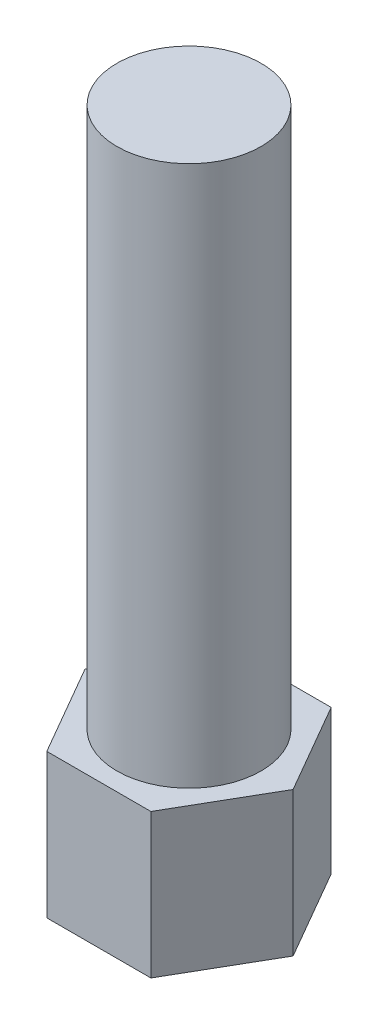
ISO-10303-21;
HEADER;
FILE_DESCRIPTION(('STEP AP214'),'2;1');
FILE_NAME('part.step','',(''),(''),'','','');
FILE_SCHEMA(('AUTOMOTIVE_DESIGN { 1 0 10303 214 1 1 1 1 }'));
ENDSEC;
DATA;
#1=APPLICATION_CONTEXT('core data for automotive mechanical design processes');
#2=APPLICATION_PROTOCOL_DEFINITION('international standard','automotive_design',2000,#1);
#3=PRODUCT_CONTEXT('',#1,'mechanical');
#4=PRODUCT('Part','Part','',(#3));
#5=PRODUCT_RELATED_PRODUCT_CATEGORY('part','',(#4));
#6=PRODUCT_DEFINITION_FORMATION('','',#4);
#7=PRODUCT_DEFINITION_CONTEXT('part definition',#1,'design');
#8=PRODUCT_DEFINITION('design','',#6,#7);
#9=PRODUCT_DEFINITION_SHAPE('','',#8);
#10=(LENGTH_UNIT() NAMED_UNIT(*) SI_UNIT(.MILLI.,.METRE.));
#11=(NAMED_UNIT(*) PLANE_ANGLE_UNIT() SI_UNIT($,.RADIAN.));
#12=(NAMED_UNIT(*) SI_UNIT($,.STERADIAN.) SOLID_ANGLE_UNIT());
#13=UNCERTAINTY_MEASURE_WITH_UNIT(LENGTH_MEASURE(1.E-05),#10,'distance_accuracy_value','');
#14=(GEOMETRIC_REPRESENTATION_CONTEXT(3) GLOBAL_UNCERTAINTY_ASSIGNED_CONTEXT((#13)) GLOBAL_UNIT_ASSIGNED_CONTEXT((#10,
#11,#12)) REPRESENTATION_CONTEXT('',''));
#15=CARTESIAN_POINT('',(0.,0.,0.));
#16=DIRECTION('',(0.,0.,1.));
#17=DIRECTION('',(1.,0.,0.));
#18=AXIS2_PLACEMENT_3D('',#15,#16,#17);
#19=CARTESIAN_POINT('',(0.,4.,0.));
#20=DIRECTION('',(0.,1.,0.));
#21=DIRECTION('',(0.,0.,1.));
#22=AXIS2_PLACEMENT_3D('',#19,#20,#21);
#23=PLANE('',#22);
#24=DIRECTION('',(0.499999999999996,0.,-0.866025403784441));
#25=VECTOR('',#24,1.);
#26=CARTESIAN_POINT('',(1.44337567297404,4.,2.50000000000004));
#27=LINE('',#26,#25);
#28=CARTESIAN_POINT('',(1.44337567297404,4.,2.50000000000004));
#29=VERTEX_POINT('',#28);
#30=CARTESIAN_POINT('',(2.88675134594812,4.,0.));
#31=VERTEX_POINT('',#30);
#32=EDGE_CURVE('E128',#29,#31,#27,.T.);
#33=ORIENTED_EDGE('',*,*,#32,.T.);
#34=DIRECTION('',(-0.499999999999999,0.,-0.866025403784439));
#35=VECTOR('',#34,1.);
#36=CARTESIAN_POINT('',(2.88675134594812,4.,0.));
#37=LINE('',#36,#35);
#38=CARTESIAN_POINT('',(1.44337567297407,4.,-2.49999999999999));
#39=VERTEX_POINT('',#38);
#40=EDGE_CURVE('E86',#31,#39,#37,.T.);
#41=ORIENTED_EDGE('',*,*,#40,.T.);
#42=DIRECTION('',(-1.,0.,0.));
#43=VECTOR('',#42,1.);
#44=CARTESIAN_POINT('',(1.44337567297407,4.,-2.49999999999999));
#45=LINE('',#44,#43);
#46=CARTESIAN_POINT('',(-1.44337567297402,4.,-2.5));
#47=VERTEX_POINT('',#46);
#48=EDGE_CURVE('E99',#39,#47,#45,.T.);
#49=ORIENTED_EDGE('',*,*,#48,.T.);
#50=DIRECTION('',(-0.499999999999998,0.,0.86602540378444));
#51=VECTOR('',#50,1.);
#52=CARTESIAN_POINT('',(-1.44337567297402,4.,-2.5));
#53=LINE('',#52,#51);
#54=CARTESIAN_POINT('',(-2.88675134594808,4.,0.));
#55=VERTEX_POINT('',#54);
#56=EDGE_CURVE('E93',#47,#55,#53,.T.);
#57=ORIENTED_EDGE('',*,*,#56,.T.);
#58=DIRECTION('',(0.499999999999986,0.,0.866025403784447));
#59=VECTOR('',#58,1.);
#60=CARTESIAN_POINT('',(-2.88675134594808,4.,0.));
#61=LINE('',#60,#59);
#62=CARTESIAN_POINT('',(-1.44337567297406,4.,2.5));
#63=VERTEX_POINT('',#62);
#64=EDGE_CURVE('E97',#55,#63,#61,.T.);
#65=ORIENTED_EDGE('',*,*,#64,.T.);
#66=DIRECTION('',(1.,0.,0.));
#67=VECTOR('',#66,1.);
#68=CARTESIAN_POINT('',(-1.44337567297406,4.,2.5));
#69=LINE('',#68,#67);
#70=EDGE_CURVE('E49',#63,#29,#69,.T.);
#71=ORIENTED_EDGE('',*,*,#70,.T.);
#72=EDGE_LOOP('',(#33,#41,#49,#57,#65,#71));
#73=FACE_BOUND('',#72,.T.);
#74=CARTESIAN_POINT('',(0.,4.,0.));
#75=DIRECTION('',(0.,1.,0.));
#76=DIRECTION('',(0.,0.,1.));
#77=AXIS2_PLACEMENT_3D('',#74,#75,#76);
#78=CIRCLE('',#77,2.);
#79=CARTESIAN_POINT('',(0.,4.,2.));
#80=VERTEX_POINT('',#79);
#81=EDGE_CURVE('E168',#80,#80,#78,.T.);
#82=ORIENTED_EDGE('',*,*,#81,.F.);
#83=EDGE_LOOP('',(#82));
#84=FACE_BOUND('',#83,.T.);
#85=ADVANCED_FACE('F32',(#73,#84),#23,.T.);
#86=CARTESIAN_POINT('',(1.44337567297404,4.,2.50000000000004));
#87=DIRECTION('',(-0.866025403784441,0.,-0.499999999999996));
#88=DIRECTION('',(-0.499999999999996,0.,0.866025403784441));
#89=AXIS2_PLACEMENT_3D('',#86,#87,#88);
#90=PLANE('',#89);
#91=DIRECTION('',(0.499999999999996,0.,-0.866025403784441));
#92=VECTOR('',#91,1.);
#93=CARTESIAN_POINT('',(1.44337567297404,0.,2.50000000000004));
#94=LINE('',#93,#92);
#95=CARTESIAN_POINT('',(1.44337567297404,0.,2.50000000000004));
#96=VERTEX_POINT('',#95);
#97=CARTESIAN_POINT('',(2.88675134594812,0.,0.));
#98=VERTEX_POINT('',#97);
#99=EDGE_CURVE('E117',#96,#98,#94,.T.);
#100=ORIENTED_EDGE('',*,*,#99,.T.);
#101=DIRECTION('',(0.,-1.,0.));
#102=VECTOR('',#101,1.);
#103=CARTESIAN_POINT('',(2.88675134594812,4.,0.));
#104=LINE('',#103,#102);
#105=EDGE_CURVE('E11',#31,#98,#104,.T.);
#106=ORIENTED_EDGE('',*,*,#105,.F.);
#107=ORIENTED_EDGE('',*,*,#32,.F.);
#108=DIRECTION('',(0.,-1.,0.));
#109=VECTOR('',#108,1.);
#110=CARTESIAN_POINT('',(1.44337567297404,4.,2.50000000000004));
#111=LINE('',#110,#109);
#112=EDGE_CURVE('E113',#29,#96,#111,.T.);
#113=ORIENTED_EDGE('',*,*,#112,.T.);
#114=EDGE_LOOP('',(#100,#106,#107,#113));
#115=FACE_BOUND('',#114,.T.);
#116=ADVANCED_FACE('F34',(#115),#90,.F.);
#117=CARTESIAN_POINT('',(2.88675134594812,4.,0.));
#118=DIRECTION('',(-0.866025403784439,0.,0.499999999999999));
#119=DIRECTION('',(0.499999999999999,0.,0.866025403784439));
#120=AXIS2_PLACEMENT_3D('',#117,#118,#119);
#121=PLANE('',#120);
#122=DIRECTION('',(-0.499999999999999,0.,-0.866025403784439));
#123=VECTOR('',#122,1.);
#124=CARTESIAN_POINT('',(2.88675134594812,0.,0.));
#125=LINE('',#124,#123);
#126=CARTESIAN_POINT('',(1.44337567297407,0.,-2.49999999999999));
#127=VERTEX_POINT('',#126);
#128=EDGE_CURVE('E120',#98,#127,#125,.T.);
#129=ORIENTED_EDGE('',*,*,#128,.T.);
#130=DIRECTION('',(0.,-1.,0.));
#131=VECTOR('',#130,1.);
#132=CARTESIAN_POINT('',(1.44337567297407,4.,-2.49999999999999));
#133=LINE('',#132,#131);
#134=EDGE_CURVE('E41',#39,#127,#133,.T.);
#135=ORIENTED_EDGE('',*,*,#134,.F.);
#136=ORIENTED_EDGE('',*,*,#40,.F.);
#137=ORIENTED_EDGE('',*,*,#105,.T.);
#138=EDGE_LOOP('',(#129,#135,#136,#137));
#139=FACE_BOUND('',#138,.T.);
#140=ADVANCED_FACE('F156',(#139),#121,.F.);
#141=CARTESIAN_POINT('',(1.44337567297407,4.,-2.49999999999999));
#142=DIRECTION('',(0.,0.,1.));
#143=DIRECTION('',(1.,0.,0.));
#144=AXIS2_PLACEMENT_3D('',#141,#142,#143);
#145=PLANE('',#144);
#146=DIRECTION('',(-1.,0.,0.));
#147=VECTOR('',#146,1.);
#148=CARTESIAN_POINT('',(1.44337567297407,0.,-2.49999999999999));
#149=LINE('',#148,#147);
#150=CARTESIAN_POINT('',(-1.44337567297402,0.,-2.5));
#151=VERTEX_POINT('',#150);
#152=EDGE_CURVE('E123',#127,#151,#149,.T.);
#153=ORIENTED_EDGE('',*,*,#152,.T.);
#154=DIRECTION('',(0.,-1.,0.));
#155=VECTOR('',#154,1.);
#156=CARTESIAN_POINT('',(-1.44337567297402,4.,-2.5));
#157=LINE('',#156,#155);
#158=EDGE_CURVE('E108',#47,#151,#157,.T.);
#159=ORIENTED_EDGE('',*,*,#158,.F.);
#160=ORIENTED_EDGE('',*,*,#48,.F.);
#161=ORIENTED_EDGE('',*,*,#134,.T.);
#162=EDGE_LOOP('',(#153,#159,#160,#161));
#163=FACE_BOUND('',#162,.T.);
#164=ADVANCED_FACE('F134',(#163),#145,.F.);
#165=CARTESIAN_POINT('',(-1.44337567297402,4.,-2.5));
#166=DIRECTION('',(0.86602540378444,0.,0.499999999999998));
#167=DIRECTION('',(0.499999999999998,0.,-0.86602540378444));
#168=AXIS2_PLACEMENT_3D('',#165,#166,#167);
#169=PLANE('',#168);
#170=DIRECTION('',(-0.499999999999998,0.,0.86602540378444));
#171=VECTOR('',#170,1.);
#172=CARTESIAN_POINT('',(-1.44337567297402,0.,-2.5));
#173=LINE('',#172,#171);
#174=CARTESIAN_POINT('',(-2.88675134594808,0.,0.));
#175=VERTEX_POINT('',#174);
#176=EDGE_CURVE('E107',#151,#175,#173,.T.);
#177=ORIENTED_EDGE('',*,*,#176,.T.);
#178=DIRECTION('',(0.,-1.,0.));
#179=VECTOR('',#178,1.);
#180=CARTESIAN_POINT('',(-2.88675134594808,4.,0.));
#181=LINE('',#180,#179);
#182=EDGE_CURVE('E104',#55,#175,#181,.T.);
#183=ORIENTED_EDGE('',*,*,#182,.F.);
#184=ORIENTED_EDGE('',*,*,#56,.F.);
#185=ORIENTED_EDGE('',*,*,#158,.T.);
#186=EDGE_LOOP('',(#177,#183,#184,#185));
#187=FACE_BOUND('',#186,.T.);
#188=ADVANCED_FACE('F105',(#187),#169,.F.);
#189=CARTESIAN_POINT('',(-2.88675134594808,4.,0.));
#190=DIRECTION('',(0.866025403784447,0.,-0.499999999999986));
#191=DIRECTION('',(-0.499999999999986,0.,-0.866025403784447));
#192=AXIS2_PLACEMENT_3D('',#189,#190,#191);
#193=PLANE('',#192);
#194=DIRECTION('',(0.499999999999986,0.,0.866025403784447));
#195=VECTOR('',#194,1.);
#196=CARTESIAN_POINT('',(-2.88675134594808,0.,0.));
#197=LINE('',#196,#195);
#198=CARTESIAN_POINT('',(-1.44337567297406,0.,2.5));
#199=VERTEX_POINT('',#198);
#200=EDGE_CURVE('E72',#175,#199,#197,.T.);
#201=ORIENTED_EDGE('',*,*,#200,.T.);
#202=DIRECTION('',(0.,-1.,0.));
#203=VECTOR('',#202,1.);
#204=CARTESIAN_POINT('',(-1.44337567297406,4.,2.5));
#205=LINE('',#204,#203);
#206=EDGE_CURVE('E109',#63,#199,#205,.T.);
#207=ORIENTED_EDGE('',*,*,#206,.F.);
#208=ORIENTED_EDGE('',*,*,#64,.F.);
#209=ORIENTED_EDGE('',*,*,#182,.T.);
#210=EDGE_LOOP('',(#201,#207,#208,#209));
#211=FACE_BOUND('',#210,.T.);
#212=ADVANCED_FACE('F111',(#211),#193,.F.);
#213=CARTESIAN_POINT('',(-1.44337567297406,4.,2.5));
#214=DIRECTION('',(0.,0.,-1.));
#215=DIRECTION('',(-1.,0.,0.));
#216=AXIS2_PLACEMENT_3D('',#213,#214,#215);
#217=PLANE('',#216);
#218=DIRECTION('',(1.,0.,0.));
#219=VECTOR('',#218,1.);
#220=CARTESIAN_POINT('',(-1.44337567297406,0.,2.5));
#221=LINE('',#220,#219);
#222=EDGE_CURVE('E78',#199,#96,#221,.T.);
#223=ORIENTED_EDGE('',*,*,#222,.T.);
#224=ORIENTED_EDGE('',*,*,#112,.F.);
#225=ORIENTED_EDGE('',*,*,#70,.F.);
#226=ORIENTED_EDGE('',*,*,#206,.T.);
#227=EDGE_LOOP('',(#223,#224,#225,#226));
#228=FACE_BOUND('',#227,.T.);
#229=ADVANCED_FACE('F141',(#228),#217,.F.);
#230=CARTESIAN_POINT('',(0.,0.,0.));
#231=DIRECTION('',(0.,1.,0.));
#232=DIRECTION('',(0.,0.,1.));
#233=AXIS2_PLACEMENT_3D('',#230,#231,#232);
#234=PLANE('',#233);
#235=ORIENTED_EDGE('',*,*,#99,.F.);
#236=ORIENTED_EDGE('',*,*,#222,.F.);
#237=ORIENTED_EDGE('',*,*,#200,.F.);
#238=ORIENTED_EDGE('',*,*,#176,.F.);
#239=ORIENTED_EDGE('',*,*,#152,.F.);
#240=ORIENTED_EDGE('',*,*,#128,.F.);
#241=EDGE_LOOP('',(#235,#236,#237,#238,#239,#240));
#242=FACE_BOUND('',#241,.T.);
#243=ADVANCED_FACE('F137',(#242),#234,.F.);
#244=CARTESIAN_POINT('',(0.,19.,0.));
#245=DIRECTION('',(0.,-1.,0.));
#246=DIRECTION('',(0.,0.,-1.));
#247=AXIS2_PLACEMENT_3D('',#244,#245,#246);
#248=CYLINDRICAL_SURFACE('',#247,2.);
#249=CARTESIAN_POINT('',(0.,19.,0.));
#250=DIRECTION('',(0.,1.,0.));
#251=DIRECTION('',(0.,0.,1.));
#252=AXIS2_PLACEMENT_3D('',#249,#250,#251);
#253=CIRCLE('',#252,2.);
#254=CARTESIAN_POINT('',(0.,19.,2.));
#255=VERTEX_POINT('',#254);
#256=EDGE_CURVE('E121',#255,#255,#253,.T.);
#257=ORIENTED_EDGE('',*,*,#256,.F.);
#258=EDGE_LOOP('',(#257));
#259=FACE_BOUND('',#258,.T.);
#260=ORIENTED_EDGE('',*,*,#81,.T.);
#261=EDGE_LOOP('',(#260));
#262=FACE_BOUND('',#261,.T.);
#263=ADVANCED_FACE('F148',(#259,#262),#248,.T.);
#264=CARTESIAN_POINT('',(0.,19.,0.));
#265=DIRECTION('',(0.,1.,0.));
#266=DIRECTION('',(0.,0.,1.));
#267=AXIS2_PLACEMENT_3D('',#264,#265,#266);
#268=PLANE('',#267);
#269=ORIENTED_EDGE('',*,*,#256,.T.);
#270=EDGE_LOOP('',(#269));
#271=FACE_BOUND('',#270,.T.);
#272=ADVANCED_FACE('F160',(#271),#268,.T.);
#273=CLOSED_SHELL('',(#85,#116,#140,#164,#188,#212,#229,#243,#263,#272));
#274=MANIFOLD_SOLID_BREP('B2',#273);
#275=ADVANCED_BREP_SHAPE_REPRESENTATION('',(#18,#274),#14);
#276=SHAPE_DEFINITION_REPRESENTATION(#9,#275);
ENDSEC;
END-ISO-10303-21;
